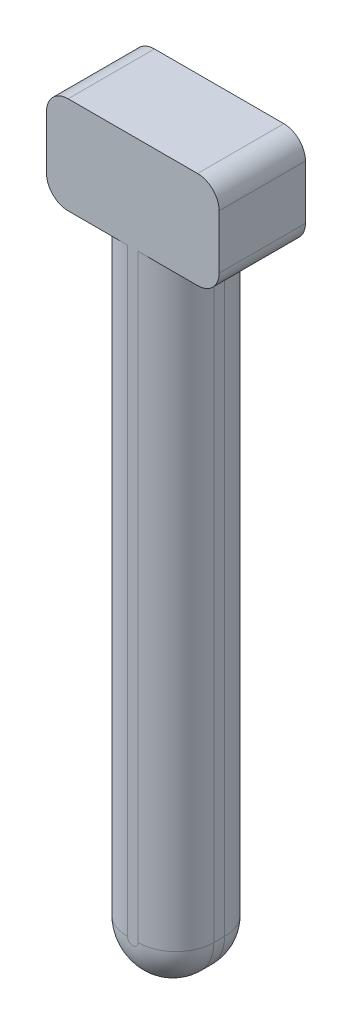
ISO-10303-21;
HEADER;
FILE_DESCRIPTION(('STEP AP214'),'2;1');
FILE_NAME('part.step','',(''),(''),'','','');
FILE_SCHEMA(('AUTOMOTIVE_DESIGN { 1 0 10303 214 1 1 1 1 }'));
ENDSEC;
DATA;
#1=APPLICATION_CONTEXT('core data for automotive mechanical design processes');
#2=APPLICATION_PROTOCOL_DEFINITION('international standard','automotive_design',2000,#1);
#3=PRODUCT_CONTEXT('',#1,'mechanical');
#4=PRODUCT('Part','Part','',(#3));
#5=PRODUCT_RELATED_PRODUCT_CATEGORY('part','',(#4));
#6=PRODUCT_DEFINITION_FORMATION('','',#4);
#7=PRODUCT_DEFINITION_CONTEXT('part definition',#1,'design');
#8=PRODUCT_DEFINITION('design','',#6,#7);
#9=PRODUCT_DEFINITION_SHAPE('','',#8);
#10=(LENGTH_UNIT() NAMED_UNIT(*) SI_UNIT(.MILLI.,.METRE.));
#11=(NAMED_UNIT(*) PLANE_ANGLE_UNIT() SI_UNIT($,.RADIAN.));
#12=(NAMED_UNIT(*) SI_UNIT($,.STERADIAN.) SOLID_ANGLE_UNIT());
#13=UNCERTAINTY_MEASURE_WITH_UNIT(LENGTH_MEASURE(1.E-05),#10,'distance_accuracy_value','');
#14=(GEOMETRIC_REPRESENTATION_CONTEXT(3) GLOBAL_UNCERTAINTY_ASSIGNED_CONTEXT((#13)) GLOBAL_UNIT_ASSIGNED_CONTEXT((#10,
#11,#12)) REPRESENTATION_CONTEXT('',''));
#15=CARTESIAN_POINT('',(0.,0.,0.));
#16=DIRECTION('',(0.,0.,1.));
#17=DIRECTION('',(1.,0.,0.));
#18=AXIS2_PLACEMENT_3D('',#15,#16,#17);
#19=CARTESIAN_POINT('',(0.,-2.25,4.));
#20=DIRECTION('',(0.,1.,0.));
#21=DIRECTION('',(0.,0.,1.));
#22=AXIS2_PLACEMENT_3D('',#19,#20,#21);
#23=PLANE('',#22);
#24=DIRECTION('',(1.,0.,0.));
#25=VECTOR('',#24,1.);
#26=CARTESIAN_POINT('',(0.,-2.25,4.));
#27=LINE('',#26,#25);
#28=CARTESIAN_POINT('',(-3.,-2.25,4.));
#29=VERTEX_POINT('',#28);
#30=CARTESIAN_POINT('',(-0.250000000000001,-2.25,4.));
#31=VERTEX_POINT('',#30);
#32=EDGE_CURVE('E242',#29,#31,#27,.T.);
#33=ORIENTED_EDGE('',*,*,#32,.F.);
#34=DIRECTION('',(0.,0.,-1.));
#35=VECTOR('',#34,1.);
#36=CARTESIAN_POINT('',(-3.,-2.25,0.));
#37=LINE('',#36,#35);
#38=CARTESIAN_POINT('',(-3.,-2.25,0.));
#39=VERTEX_POINT('',#38);
#40=EDGE_CURVE('E194',#29,#39,#37,.T.);
#41=ORIENTED_EDGE('',*,*,#40,.T.);
#42=DIRECTION('',(1.,0.,0.));
#43=VECTOR('',#42,1.);
#44=CARTESIAN_POINT('',(0.,-2.25,0.));
#45=LINE('',#44,#43);
#46=CARTESIAN_POINT('',(-0.250000000000001,-2.25,0.));
#47=VERTEX_POINT('',#46);
#48=EDGE_CURVE('E260',#39,#47,#45,.T.);
#49=ORIENTED_EDGE('',*,*,#48,.T.);
#50=CARTESIAN_POINT('',(-0.250000000000001,-2.25,1.75));
#51=DIRECTION('',(0.,1.,0.));
#52=DIRECTION('',(0.,0.,1.));
#53=AXIS2_PLACEMENT_3D('',#50,#51,#52);
#54=CIRCLE('',#53,1.75);
#55=CARTESIAN_POINT('',(-2.,-2.25,1.75));
#56=VERTEX_POINT('',#55);
#57=EDGE_CURVE('E288',#47,#56,#54,.T.);
#58=ORIENTED_EDGE('',*,*,#57,.T.);
#59=DIRECTION('',(0.,0.,-1.));
#60=VECTOR('',#59,1.);
#61=CARTESIAN_POINT('',(-2.,-2.25,4.));
#62=LINE('',#61,#60);
#63=CARTESIAN_POINT('',(-2.,-2.25,2.25));
#64=VERTEX_POINT('',#63);
#65=EDGE_CURVE('E172',#64,#56,#62,.T.);
#66=ORIENTED_EDGE('',*,*,#65,.F.);
#67=CARTESIAN_POINT('',(-0.250000000000001,-2.25,2.25));
#68=DIRECTION('',(0.,1.,0.));
#69=DIRECTION('',(0.,0.,1.));
#70=AXIS2_PLACEMENT_3D('',#67,#68,#69);
#71=CIRCLE('',#70,1.75);
#72=EDGE_CURVE('E181',#64,#31,#71,.T.);
#73=ORIENTED_EDGE('',*,*,#72,.T.);
#74=EDGE_LOOP('',(#33,#41,#49,#58,#66,#73));
#75=FACE_BOUND('',#74,.T.);
#76=ADVANCED_FACE('F35',(#75),#23,.F.);
#77=CARTESIAN_POINT('',(-2.,0.,4.));
#78=DIRECTION('',(1.,0.,0.));
#79=DIRECTION('',(0.,1.,0.));
#80=AXIS2_PLACEMENT_3D('',#77,#78,#79);
#81=PLANE('',#80);
#82=ORIENTED_EDGE('',*,*,#65,.T.);
#83=DIRECTION('',(0.,-1.,0.));
#84=VECTOR('',#83,1.);
#85=CARTESIAN_POINT('',(-2.,0.,1.75));
#86=LINE('',#85,#84);
#87=CARTESIAN_POINT('',(-2.,-30.,1.75));
#88=VERTEX_POINT('',#87);
#89=EDGE_CURVE('E171',#56,#88,#86,.T.);
#90=ORIENTED_EDGE('',*,*,#89,.T.);
#91=DIRECTION('',(0.,0.,-1.));
#92=VECTOR('',#91,1.);
#93=CARTESIAN_POINT('',(-2.,-30.,4.));
#94=LINE('',#93,#92);
#95=CARTESIAN_POINT('',(-2.,-30.,2.25));
#96=VERTEX_POINT('',#95);
#97=EDGE_CURVE('E153',#96,#88,#94,.T.);
#98=ORIENTED_EDGE('',*,*,#97,.F.);
#99=DIRECTION('',(0.,-1.,0.));
#100=VECTOR('',#99,1.);
#101=CARTESIAN_POINT('',(-2.,-2.25,2.25));
#102=LINE('',#101,#100);
#103=EDGE_CURVE('E168',#96,#64,#102,.F.);
#104=ORIENTED_EDGE('',*,*,#103,.T.);
#105=EDGE_LOOP('',(#82,#90,#98,#104));
#106=FACE_BOUND('',#105,.T.);
#107=ADVANCED_FACE('F167',(#106),#81,.F.);
#108=CARTESIAN_POINT('',(0.,-30.,4.));
#109=DIRECTION('',(0.,0.,-1.));
#110=DIRECTION('',(-1.,0.,0.));
#111=AXIS2_PLACEMENT_3D('',#108,#109,#110);
#112=CYLINDRICAL_SURFACE('',#111,2.);
#113=ORIENTED_EDGE('',*,*,#97,.T.);
#114=CARTESIAN_POINT('',(0.,-30.,1.75));
#115=DIRECTION('',(0.,0.,1.));
#116=DIRECTION('',(1.,0.,0.));
#117=AXIS2_PLACEMENT_3D('',#114,#115,#116);
#118=CIRCLE('',#117,2.);
#119=CARTESIAN_POINT('',(2.,-30.,1.75));
#120=VERTEX_POINT('',#119);
#121=EDGE_CURVE('E160',#88,#120,#118,.T.);
#122=ORIENTED_EDGE('',*,*,#121,.T.);
#123=DIRECTION('',(0.,0.,-1.));
#124=VECTOR('',#123,1.);
#125=CARTESIAN_POINT('',(2.,-30.,4.));
#126=LINE('',#125,#124);
#127=CARTESIAN_POINT('',(2.,-30.,2.25));
#128=VERTEX_POINT('',#127);
#129=EDGE_CURVE('E155',#128,#120,#126,.T.);
#130=ORIENTED_EDGE('',*,*,#129,.F.);
#131=CARTESIAN_POINT('',(0.,-30.,2.25));
#132=DIRECTION('',(0.,0.,1.));
#133=DIRECTION('',(1.,0.,0.));
#134=AXIS2_PLACEMENT_3D('',#131,#132,#133);
#135=CIRCLE('',#134,2.);
#136=EDGE_CURVE('E150',#128,#96,#135,.F.);
#137=ORIENTED_EDGE('',*,*,#136,.T.);
#138=EDGE_LOOP('',(#113,#122,#130,#137));
#139=FACE_BOUND('',#138,.T.);
#140=ADVANCED_FACE('F152',(#139),#112,.T.);
#141=CARTESIAN_POINT('',(2.,0.,4.));
#142=DIRECTION('',(1.,0.,0.));
#143=DIRECTION('',(0.,1.,0.));
#144=AXIS2_PLACEMENT_3D('',#141,#142,#143);
#145=PLANE('',#144);
#146=ORIENTED_EDGE('',*,*,#129,.T.);
#147=DIRECTION('',(0.,-1.,0.));
#148=VECTOR('',#147,1.);
#149=CARTESIAN_POINT('',(2.,-2.25,1.75));
#150=LINE('',#149,#148);
#151=CARTESIAN_POINT('',(2.,-2.25,1.75));
#152=VERTEX_POINT('',#151);
#153=EDGE_CURVE('E286',#120,#152,#150,.F.);
#154=ORIENTED_EDGE('',*,*,#153,.T.);
#155=DIRECTION('',(0.,0.,-1.));
#156=VECTOR('',#155,1.);
#157=CARTESIAN_POINT('',(2.,-2.25,4.));
#158=LINE('',#157,#156);
#159=CARTESIAN_POINT('',(2.,-2.25,2.25));
#160=VERTEX_POINT('',#159);
#161=EDGE_CURVE('E266',#160,#152,#158,.T.);
#162=ORIENTED_EDGE('',*,*,#161,.F.);
#163=DIRECTION('',(0.,-1.,0.));
#164=VECTOR('',#163,1.);
#165=CARTESIAN_POINT('',(2.,0.,2.25));
#166=LINE('',#165,#164);
#167=EDGE_CURVE('E284',#160,#128,#166,.T.);
#168=ORIENTED_EDGE('',*,*,#167,.T.);
#169=EDGE_LOOP('',(#146,#154,#162,#168));
#170=FACE_BOUND('',#169,.T.);
#171=ADVANCED_FACE('F327',(#170),#145,.T.);
#172=CARTESIAN_POINT('',(0.249999999999999,-2.25,0.));
#173=VERTEX_POINT('',#172);
#174=CARTESIAN_POINT('',(3.,-2.25,0.));
#175=VERTEX_POINT('',#174);
#176=EDGE_CURVE('E232',#173,#175,#45,.T.);
#177=ORIENTED_EDGE('',*,*,#176,.T.);
#178=DIRECTION('',(0.,0.,-1.));
#179=VECTOR('',#178,1.);
#180=CARTESIAN_POINT('',(3.,-2.25,4.));
#181=LINE('',#180,#179);
#182=CARTESIAN_POINT('',(3.,-2.25,4.));
#183=VERTEX_POINT('',#182);
#184=EDGE_CURVE('E223',#175,#183,#181,.F.);
#185=ORIENTED_EDGE('',*,*,#184,.T.);
#186=CARTESIAN_POINT('',(0.249999999999999,-2.25,4.));
#187=VERTEX_POINT('',#186);
#188=EDGE_CURVE('E229',#187,#183,#27,.T.);
#189=ORIENTED_EDGE('',*,*,#188,.F.);
#190=CARTESIAN_POINT('',(0.249999999999999,-2.25,2.25));
#191=DIRECTION('',(0.,1.,0.));
#192=DIRECTION('',(0.,0.,1.));
#193=AXIS2_PLACEMENT_3D('',#190,#191,#192);
#194=CIRCLE('',#193,1.75);
#195=EDGE_CURVE('E198',#187,#160,#194,.T.);
#196=ORIENTED_EDGE('',*,*,#195,.T.);
#197=ORIENTED_EDGE('',*,*,#161,.T.);
#198=CARTESIAN_POINT('',(0.249999999999999,-2.25,1.75));
#199=DIRECTION('',(0.,1.,0.));
#200=DIRECTION('',(0.,0.,1.));
#201=AXIS2_PLACEMENT_3D('',#198,#199,#200);
#202=CIRCLE('',#201,1.75);
#203=EDGE_CURVE('E291',#152,#173,#202,.T.);
#204=ORIENTED_EDGE('',*,*,#203,.T.);
#205=EDGE_LOOP('',(#177,#185,#189,#196,#197,#204));
#206=FACE_BOUND('',#205,.T.);
#207=ADVANCED_FACE('F228',(#206),#23,.F.);
#208=CARTESIAN_POINT('',(4.,0.,4.));
#209=DIRECTION('',(-1.,0.,0.));
#210=DIRECTION('',(0.,0.,1.));
#211=AXIS2_PLACEMENT_3D('',#208,#209,#210);
#212=PLANE('',#211);
#213=DIRECTION('',(0.,1.,0.));
#214=VECTOR('',#213,1.);
#215=CARTESIAN_POINT('',(4.,0.,4.));
#216=LINE('',#215,#214);
#217=CARTESIAN_POINT('',(4.,-1.25,4.));
#218=VERTEX_POINT('',#217);
#219=CARTESIAN_POINT('',(4.,1.25,4.));
#220=VERTEX_POINT('',#219);
#221=EDGE_CURVE('E241',#218,#220,#216,.T.);
#222=ORIENTED_EDGE('',*,*,#221,.F.);
#223=DIRECTION('',(0.,0.,-1.));
#224=VECTOR('',#223,1.);
#225=CARTESIAN_POINT('',(4.,-1.25,4.));
#226=LINE('',#225,#224);
#227=CARTESIAN_POINT('',(4.,-1.25,0.));
#228=VERTEX_POINT('',#227);
#229=EDGE_CURVE('E220',#218,#228,#226,.T.);
#230=ORIENTED_EDGE('',*,*,#229,.T.);
#231=DIRECTION('',(0.,1.,0.));
#232=VECTOR('',#231,1.);
#233=CARTESIAN_POINT('',(4.,0.,0.));
#234=LINE('',#233,#232);
#235=CARTESIAN_POINT('',(4.,1.25,0.));
#236=VERTEX_POINT('',#235);
#237=EDGE_CURVE('E250',#228,#236,#234,.T.);
#238=ORIENTED_EDGE('',*,*,#237,.T.);
#239=DIRECTION('',(0.,0.,-1.));
#240=VECTOR('',#239,1.);
#241=CARTESIAN_POINT('',(4.,1.25,4.));
#242=LINE('',#241,#240);
#243=EDGE_CURVE('E218',#236,#220,#242,.F.);
#244=ORIENTED_EDGE('',*,*,#243,.T.);
#245=EDGE_LOOP('',(#222,#230,#238,#244));
#246=FACE_BOUND('',#245,.T.);
#247=ADVANCED_FACE('F249',(#246),#212,.F.);
#248=CARTESIAN_POINT('',(0.,2.25,4.));
#249=DIRECTION('',(0.,1.,0.));
#250=DIRECTION('',(0.,0.,1.));
#251=AXIS2_PLACEMENT_3D('',#248,#249,#250);
#252=PLANE('',#251);
#253=DIRECTION('',(1.,0.,0.));
#254=VECTOR('',#253,1.);
#255=CARTESIAN_POINT('',(0.,2.25,4.));
#256=LINE('',#255,#254);
#257=CARTESIAN_POINT('',(-3.,2.25,4.));
#258=VERTEX_POINT('',#257);
#259=CARTESIAN_POINT('',(3.,2.25,4.));
#260=VERTEX_POINT('',#259);
#261=EDGE_CURVE('E368',#258,#260,#256,.T.);
#262=ORIENTED_EDGE('',*,*,#261,.T.);
#263=DIRECTION('',(0.,0.,-1.));
#264=VECTOR('',#263,1.);
#265=CARTESIAN_POINT('',(3.,2.25,0.));
#266=LINE('',#265,#264);
#267=CARTESIAN_POINT('',(3.,2.25,0.));
#268=VERTEX_POINT('',#267);
#269=EDGE_CURVE('E11',#260,#268,#266,.T.);
#270=ORIENTED_EDGE('',*,*,#269,.T.);
#271=DIRECTION('',(1.,0.,0.));
#272=VECTOR('',#271,1.);
#273=CARTESIAN_POINT('',(0.,2.25,0.));
#274=LINE('',#273,#272);
#275=CARTESIAN_POINT('',(-3.,2.25,0.));
#276=VERTEX_POINT('',#275);
#277=EDGE_CURVE('E256',#276,#268,#274,.T.);
#278=ORIENTED_EDGE('',*,*,#277,.F.);
#279=DIRECTION('',(0.,0.,-1.));
#280=VECTOR('',#279,1.);
#281=CARTESIAN_POINT('',(-3.,2.25,4.));
#282=LINE('',#281,#280);
#283=EDGE_CURVE('E43',#276,#258,#282,.F.);
#284=ORIENTED_EDGE('',*,*,#283,.T.);
#285=EDGE_LOOP('',(#262,#270,#278,#284));
#286=FACE_BOUND('',#285,.T.);
#287=ADVANCED_FACE('F332',(#286),#252,.T.);
#288=CARTESIAN_POINT('',(-4.,0.,4.));
#289=DIRECTION('',(-1.,0.,0.));
#290=DIRECTION('',(0.,0.,1.));
#291=AXIS2_PLACEMENT_3D('',#288,#289,#290);
#292=PLANE('',#291);
#293=DIRECTION('',(0.,1.,0.));
#294=VECTOR('',#293,1.);
#295=CARTESIAN_POINT('',(-4.,0.,0.));
#296=LINE('',#295,#294);
#297=CARTESIAN_POINT('',(-4.,-1.25,0.));
#298=VERTEX_POINT('',#297);
#299=CARTESIAN_POINT('',(-4.,1.25,0.));
#300=VERTEX_POINT('',#299);
#301=EDGE_CURVE('E258',#298,#300,#296,.T.);
#302=ORIENTED_EDGE('',*,*,#301,.F.);
#303=DIRECTION('',(0.,0.,-1.));
#304=VECTOR('',#303,1.);
#305=CARTESIAN_POINT('',(-4.,-1.25,4.));
#306=LINE('',#305,#304);
#307=CARTESIAN_POINT('',(-4.,-1.25,4.));
#308=VERTEX_POINT('',#307);
#309=EDGE_CURVE('E209',#298,#308,#306,.F.);
#310=ORIENTED_EDGE('',*,*,#309,.T.);
#311=DIRECTION('',(0.,1.,0.));
#312=VECTOR('',#311,1.);
#313=CARTESIAN_POINT('',(-4.,0.,4.));
#314=LINE('',#313,#312);
#315=CARTESIAN_POINT('',(-4.,1.25,4.));
#316=VERTEX_POINT('',#315);
#317=EDGE_CURVE('E269',#308,#316,#314,.T.);
#318=ORIENTED_EDGE('',*,*,#317,.T.);
#319=DIRECTION('',(0.,0.,-1.));
#320=VECTOR('',#319,1.);
#321=CARTESIAN_POINT('',(-4.,1.25,4.));
#322=LINE('',#321,#320);
#323=EDGE_CURVE('E206',#316,#300,#322,.T.);
#324=ORIENTED_EDGE('',*,*,#323,.T.);
#325=EDGE_LOOP('',(#302,#310,#318,#324));
#326=FACE_BOUND('',#325,.T.);
#327=ADVANCED_FACE('F374',(#326),#292,.T.);
#328=CARTESIAN_POINT('',(0.,0.,4.));
#329=DIRECTION('',(0.,0.,1.));
#330=DIRECTION('',(1.,0.,0.));
#331=AXIS2_PLACEMENT_3D('',#328,#329,#330);
#332=PLANE('',#331);
#333=ORIENTED_EDGE('',*,*,#317,.F.);
#334=CARTESIAN_POINT('',(-3.,-1.25,4.));
#335=DIRECTION('',(0.,0.,1.));
#336=DIRECTION('',(1.,0.,0.));
#337=AXIS2_PLACEMENT_3D('',#334,#335,#336);
#338=CIRCLE('',#337,1.);
#339=EDGE_CURVE('E216',#308,#29,#338,.T.);
#340=ORIENTED_EDGE('',*,*,#339,.T.);
#341=ORIENTED_EDGE('',*,*,#32,.T.);
#342=DIRECTION('',(0.,-1.,0.));
#343=VECTOR('',#342,1.);
#344=CARTESIAN_POINT('',(-0.249999999999995,-30.,4.));
#345=LINE('',#344,#343);
#346=CARTESIAN_POINT('',(-0.249999999999995,-30.,4.));
#347=VERTEX_POINT('',#346);
#348=EDGE_CURVE('E282',#31,#347,#345,.T.);
#349=ORIENTED_EDGE('',*,*,#348,.T.);
#350=CARTESIAN_POINT('',(0.,-30.,4.));
#351=DIRECTION('',(0.,0.,1.));
#352=DIRECTION('',(1.,0.,0.));
#353=AXIS2_PLACEMENT_3D('',#350,#351,#352);
#354=CIRCLE('',#353,0.25);
#355=CARTESIAN_POINT('',(0.250000000000005,-30.,4.));
#356=VERTEX_POINT('',#355);
#357=EDGE_CURVE('E184',#347,#356,#354,.T.);
#358=ORIENTED_EDGE('',*,*,#357,.T.);
#359=DIRECTION('',(0.,-1.,0.));
#360=VECTOR('',#359,1.);
#361=CARTESIAN_POINT('',(0.249999999999998,0.,4.));
#362=LINE('',#361,#360);
#363=EDGE_CURVE('E239',#356,#187,#362,.F.);
#364=ORIENTED_EDGE('',*,*,#363,.T.);
#365=ORIENTED_EDGE('',*,*,#188,.T.);
#366=CARTESIAN_POINT('',(3.,-1.25,4.));
#367=DIRECTION('',(0.,0.,1.));
#368=DIRECTION('',(1.,0.,0.));
#369=AXIS2_PLACEMENT_3D('',#366,#367,#368);
#370=CIRCLE('',#369,1.);
#371=EDGE_CURVE('E214',#183,#218,#370,.T.);
#372=ORIENTED_EDGE('',*,*,#371,.T.);
#373=ORIENTED_EDGE('',*,*,#221,.T.);
#374=CARTESIAN_POINT('',(3.,1.25,4.));
#375=DIRECTION('',(0.,0.,1.));
#376=DIRECTION('',(1.,0.,0.));
#377=AXIS2_PLACEMENT_3D('',#374,#375,#376);
#378=CIRCLE('',#377,1.);
#379=EDGE_CURVE('E50',#220,#260,#378,.T.);
#380=ORIENTED_EDGE('',*,*,#379,.T.);
#381=ORIENTED_EDGE('',*,*,#261,.F.);
#382=CARTESIAN_POINT('',(-3.,1.25,4.));
#383=DIRECTION('',(0.,0.,1.));
#384=DIRECTION('',(1.,0.,0.));
#385=AXIS2_PLACEMENT_3D('',#382,#383,#384);
#386=CIRCLE('',#385,1.);
#387=EDGE_CURVE('E211',#258,#316,#386,.T.);
#388=ORIENTED_EDGE('',*,*,#387,.T.);
#389=EDGE_LOOP('',(#333,#340,#341,#349,#358,#364,#365,#372,#373,#380,#381,#388));
#390=FACE_BOUND('',#389,.T.);
#391=ADVANCED_FACE('F236',(#390),#332,.T.);
#392=CARTESIAN_POINT('',(0.,0.,0.));
#393=DIRECTION('',(0.,0.,1.));
#394=DIRECTION('',(1.,0.,0.));
#395=AXIS2_PLACEMENT_3D('',#392,#393,#394);
#396=PLANE('',#395);
#397=ORIENTED_EDGE('',*,*,#48,.F.);
#398=CARTESIAN_POINT('',(-3.,-1.25,0.));
#399=DIRECTION('',(0.,0.,1.));
#400=DIRECTION('',(1.,0.,0.));
#401=AXIS2_PLACEMENT_3D('',#398,#399,#400);
#402=CIRCLE('',#401,1.);
#403=EDGE_CURVE('E204',#39,#298,#402,.F.);
#404=ORIENTED_EDGE('',*,*,#403,.T.);
#405=ORIENTED_EDGE('',*,*,#301,.T.);
#406=CARTESIAN_POINT('',(-3.,1.25,0.));
#407=DIRECTION('',(0.,0.,1.));
#408=DIRECTION('',(1.,0.,0.));
#409=AXIS2_PLACEMENT_3D('',#406,#407,#408);
#410=CIRCLE('',#409,1.);
#411=EDGE_CURVE('E197',#300,#276,#410,.F.);
#412=ORIENTED_EDGE('',*,*,#411,.T.);
#413=ORIENTED_EDGE('',*,*,#277,.T.);
#414=CARTESIAN_POINT('',(3.,1.25,0.));
#415=DIRECTION('',(0.,0.,1.));
#416=DIRECTION('',(1.,0.,0.));
#417=AXIS2_PLACEMENT_3D('',#414,#415,#416);
#418=CIRCLE('',#417,1.);
#419=EDGE_CURVE('E200',#268,#236,#418,.F.);
#420=ORIENTED_EDGE('',*,*,#419,.T.);
#421=ORIENTED_EDGE('',*,*,#237,.F.);
#422=CARTESIAN_POINT('',(3.,-1.25,0.));
#423=DIRECTION('',(0.,0.,1.));
#424=DIRECTION('',(1.,0.,0.));
#425=AXIS2_PLACEMENT_3D('',#422,#423,#424);
#426=CIRCLE('',#425,1.);
#427=EDGE_CURVE('E202',#228,#175,#426,.F.);
#428=ORIENTED_EDGE('',*,*,#427,.T.);
#429=ORIENTED_EDGE('',*,*,#176,.F.);
#430=DIRECTION('',(0.,-1.,0.));
#431=VECTOR('',#430,1.);
#432=CARTESIAN_POINT('',(0.250000000000005,-30.,0.));
#433=LINE('',#432,#431);
#434=CARTESIAN_POINT('',(0.250000000000005,-30.,0.));
#435=VERTEX_POINT('',#434);
#436=EDGE_CURVE('E273',#173,#435,#433,.T.);
#437=ORIENTED_EDGE('',*,*,#436,.T.);
#438=CARTESIAN_POINT('',(0.,-30.,0.));
#439=DIRECTION('',(0.,0.,1.));
#440=DIRECTION('',(1.,0.,0.));
#441=AXIS2_PLACEMENT_3D('',#438,#439,#440);
#442=CIRCLE('',#441,0.25);
#443=CARTESIAN_POINT('',(-0.249999999999995,-30.,0.));
#444=VERTEX_POINT('',#443);
#445=EDGE_CURVE('E275',#435,#444,#442,.F.);
#446=ORIENTED_EDGE('',*,*,#445,.T.);
#447=DIRECTION('',(0.,-1.,0.));
#448=VECTOR('',#447,1.);
#449=CARTESIAN_POINT('',(-0.250000000000002,0.,0.));
#450=LINE('',#449,#448);
#451=EDGE_CURVE('E161',#444,#47,#450,.F.);
#452=ORIENTED_EDGE('',*,*,#451,.T.);
#453=EDGE_LOOP('',(#397,#404,#405,#412,#413,#420,#421,#428,#429,#437,#446,#452));
#454=FACE_BOUND('',#453,.T.);
#455=ADVANCED_FACE('F254',(#454),#396,.F.);
#456=CARTESIAN_POINT('',(0.249999999999998,0.,1.75));
#457=DIRECTION('',(0.,1.,0.));
#458=DIRECTION('',(-1.,0.,0.));
#459=AXIS2_PLACEMENT_3D('',#456,#457,#458);
#460=CYLINDRICAL_SURFACE('',#459,1.75);
#461=ORIENTED_EDGE('',*,*,#203,.F.);
#462=ORIENTED_EDGE('',*,*,#153,.F.);
#463=CARTESIAN_POINT('',(0.250000000000005,-30.,1.75));
#464=DIRECTION('',(0.,-1.,0.));
#465=DIRECTION('',(0.,0.,-1.));
#466=AXIS2_PLACEMENT_3D('',#463,#464,#465);
#467=CIRCLE('',#466,1.75);
#468=EDGE_CURVE('E191',#435,#120,#467,.T.);
#469=ORIENTED_EDGE('',*,*,#468,.F.);
#470=ORIENTED_EDGE('',*,*,#436,.F.);
#471=EDGE_LOOP('',(#461,#462,#469,#470));
#472=FACE_BOUND('',#471,.T.);
#473=ADVANCED_FACE('F316',(#472),#460,.T.);
#474=CARTESIAN_POINT('',(0.,-30.,1.75));
#475=DIRECTION('',(0.,0.,1.));
#476=DIRECTION('',(1.,0.,0.));
#477=AXIS2_PLACEMENT_3D('',#474,#475,#476);
#478=DEGENERATE_TOROIDAL_SURFACE('',#477,0.25,1.75,.T.);
#479=ORIENTED_EDGE('',*,*,#468,.T.);
#480=ORIENTED_EDGE('',*,*,#121,.F.);
#481=CARTESIAN_POINT('',(-0.249999999999995,-30.,1.75));
#482=DIRECTION('',(0.,1.,0.));
#483=DIRECTION('',(0.,0.,1.));
#484=AXIS2_PLACEMENT_3D('',#481,#482,#483);
#485=CIRCLE('',#484,1.75);
#486=EDGE_CURVE('E188',#444,#88,#485,.T.);
#487=ORIENTED_EDGE('',*,*,#486,.F.);
#488=ORIENTED_EDGE('',*,*,#445,.F.);
#489=EDGE_LOOP('',(#479,#480,#487,#488));
#490=FACE_BOUND('',#489,.T.);
#491=ADVANCED_FACE('F308',(#490),#478,.T.);
#492=CARTESIAN_POINT('',(-0.250000000000002,0.,1.75));
#493=DIRECTION('',(0.,-1.,0.));
#494=DIRECTION('',(1.,0.,0.));
#495=AXIS2_PLACEMENT_3D('',#492,#493,#494);
#496=CYLINDRICAL_SURFACE('',#495,1.75);
#497=ORIENTED_EDGE('',*,*,#57,.F.);
#498=ORIENTED_EDGE('',*,*,#451,.F.);
#499=ORIENTED_EDGE('',*,*,#486,.T.);
#500=ORIENTED_EDGE('',*,*,#89,.F.);
#501=EDGE_LOOP('',(#497,#498,#499,#500));
#502=FACE_BOUND('',#501,.T.);
#503=ADVANCED_FACE('F305',(#502),#496,.T.);
#504=CARTESIAN_POINT('',(0.249999999999998,0.,2.25));
#505=DIRECTION('',(0.,-1.,0.));
#506=DIRECTION('',(1.,0.,0.));
#507=AXIS2_PLACEMENT_3D('',#504,#505,#506);
#508=CYLINDRICAL_SURFACE('',#507,1.75);
#509=ORIENTED_EDGE('',*,*,#195,.F.);
#510=ORIENTED_EDGE('',*,*,#363,.F.);
#511=CARTESIAN_POINT('',(0.250000000000005,-30.,2.25));
#512=DIRECTION('',(0.,-1.,0.));
#513=DIRECTION('',(0.,0.,-1.));
#514=AXIS2_PLACEMENT_3D('',#511,#512,#513);
#515=CIRCLE('',#514,1.75);
#516=EDGE_CURVE('E186',#128,#356,#515,.T.);
#517=ORIENTED_EDGE('',*,*,#516,.F.);
#518=ORIENTED_EDGE('',*,*,#167,.F.);
#519=EDGE_LOOP('',(#509,#510,#517,#518));
#520=FACE_BOUND('',#519,.T.);
#521=ADVANCED_FACE('F307',(#520),#508,.T.);
#522=CARTESIAN_POINT('',(0.,-30.,2.25));
#523=DIRECTION('',(0.,0.,1.));
#524=DIRECTION('',(1.,0.,0.));
#525=AXIS2_PLACEMENT_3D('',#522,#523,#524);
#526=DEGENERATE_TOROIDAL_SURFACE('',#525,0.25,1.75,.T.);
#527=ORIENTED_EDGE('',*,*,#516,.T.);
#528=ORIENTED_EDGE('',*,*,#357,.F.);
#529=CARTESIAN_POINT('',(-0.249999999999995,-30.,2.25));
#530=DIRECTION('',(0.,1.,0.));
#531=DIRECTION('',(0.,0.,1.));
#532=AXIS2_PLACEMENT_3D('',#529,#530,#531);
#533=CIRCLE('',#532,1.75);
#534=EDGE_CURVE('E178',#96,#347,#533,.T.);
#535=ORIENTED_EDGE('',*,*,#534,.F.);
#536=ORIENTED_EDGE('',*,*,#136,.F.);
#537=EDGE_LOOP('',(#527,#528,#535,#536));
#538=FACE_BOUND('',#537,.T.);
#539=ADVANCED_FACE('F183',(#538),#526,.T.);
#540=CARTESIAN_POINT('',(-0.250000000000002,0.,2.25));
#541=DIRECTION('',(0.,1.,0.));
#542=DIRECTION('',(-1.,0.,0.));
#543=AXIS2_PLACEMENT_3D('',#540,#541,#542);
#544=CYLINDRICAL_SURFACE('',#543,1.75);
#545=ORIENTED_EDGE('',*,*,#72,.F.);
#546=ORIENTED_EDGE('',*,*,#103,.F.);
#547=ORIENTED_EDGE('',*,*,#534,.T.);
#548=ORIENTED_EDGE('',*,*,#348,.F.);
#549=EDGE_LOOP('',(#545,#546,#547,#548));
#550=FACE_BOUND('',#549,.T.);
#551=ADVANCED_FACE('F176',(#550),#544,.T.);
#552=CARTESIAN_POINT('',(-3.,-1.25,4.));
#553=DIRECTION('',(0.,0.,1.));
#554=DIRECTION('',(1.,0.,0.));
#555=AXIS2_PLACEMENT_3D('',#552,#553,#554);
#556=CYLINDRICAL_SURFACE('',#555,1.);
#557=ORIENTED_EDGE('',*,*,#339,.F.);
#558=ORIENTED_EDGE('',*,*,#309,.F.);
#559=ORIENTED_EDGE('',*,*,#403,.F.);
#560=ORIENTED_EDGE('',*,*,#40,.F.);
#561=EDGE_LOOP('',(#557,#558,#559,#560));
#562=FACE_BOUND('',#561,.T.);
#563=ADVANCED_FACE('F353',(#562),#556,.T.);
#564=CARTESIAN_POINT('',(3.,-1.25,4.));
#565=DIRECTION('',(0.,0.,-1.));
#566=DIRECTION('',(-1.,0.,0.));
#567=AXIS2_PLACEMENT_3D('',#564,#565,#566);
#568=CYLINDRICAL_SURFACE('',#567,1.);
#569=ORIENTED_EDGE('',*,*,#371,.F.);
#570=ORIENTED_EDGE('',*,*,#184,.F.);
#571=ORIENTED_EDGE('',*,*,#427,.F.);
#572=ORIENTED_EDGE('',*,*,#229,.F.);
#573=EDGE_LOOP('',(#569,#570,#571,#572));
#574=FACE_BOUND('',#573,.T.);
#575=ADVANCED_FACE('F245',(#574),#568,.T.);
#576=CARTESIAN_POINT('',(3.,1.25,4.));
#577=DIRECTION('',(0.,0.,1.));
#578=DIRECTION('',(1.,0.,0.));
#579=AXIS2_PLACEMENT_3D('',#576,#577,#578);
#580=CYLINDRICAL_SURFACE('',#579,1.);
#581=ORIENTED_EDGE('',*,*,#379,.F.);
#582=ORIENTED_EDGE('',*,*,#243,.F.);
#583=ORIENTED_EDGE('',*,*,#419,.F.);
#584=ORIENTED_EDGE('',*,*,#269,.F.);
#585=EDGE_LOOP('',(#581,#582,#583,#584));
#586=FACE_BOUND('',#585,.T.);
#587=ADVANCED_FACE('F360',(#586),#580,.T.);
#588=CARTESIAN_POINT('',(-3.,1.25,4.));
#589=DIRECTION('',(0.,0.,-1.));
#590=DIRECTION('',(-1.,0.,0.));
#591=AXIS2_PLACEMENT_3D('',#588,#589,#590);
#592=CYLINDRICAL_SURFACE('',#591,1.);
#593=ORIENTED_EDGE('',*,*,#387,.F.);
#594=ORIENTED_EDGE('',*,*,#283,.F.);
#595=ORIENTED_EDGE('',*,*,#411,.F.);
#596=ORIENTED_EDGE('',*,*,#323,.F.);
#597=EDGE_LOOP('',(#593,#594,#595,#596));
#598=FACE_BOUND('',#597,.T.);
#599=ADVANCED_FACE('F37',(#598),#592,.T.);
#600=CLOSED_SHELL('',(#76,#107,#140,#171,#207,#247,#287,#327,#391,#455,#473,#491,#503,#521,#539,
#551,#563,#575,#587,#599));
#601=MANIFOLD_SOLID_BREP('B2',#600);
#602=ADVANCED_BREP_SHAPE_REPRESENTATION('',(#18,#601),#14);
#603=SHAPE_DEFINITION_REPRESENTATION(#9,#602);
ENDSEC;
END-ISO-10303-21;
